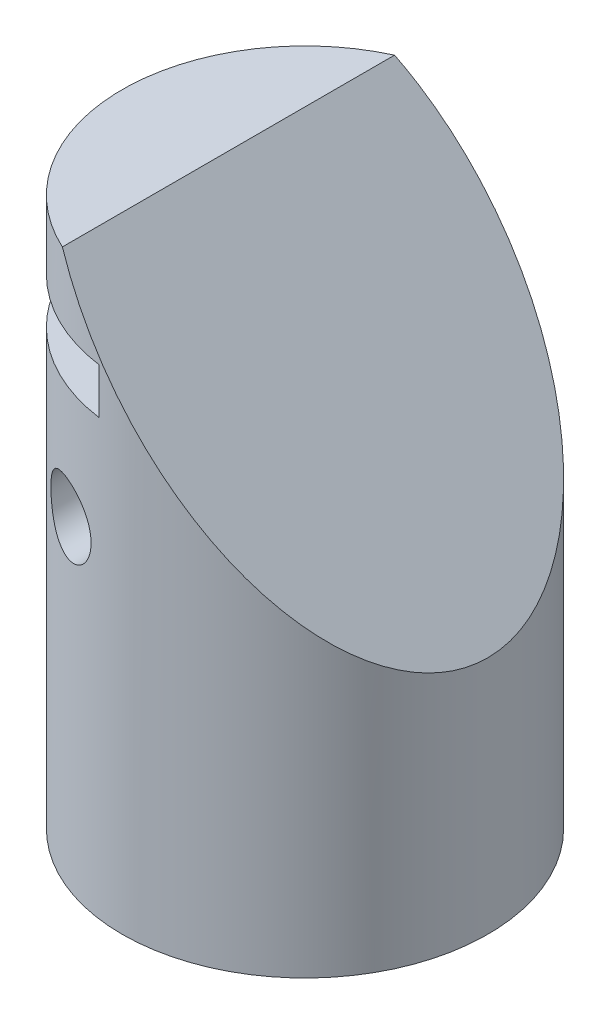
ISO-10303-21;
HEADER;
FILE_DESCRIPTION(('STEP AP214'),'2;1');
FILE_NAME('part.step','',(''),(''),'','','');
FILE_SCHEMA(('AUTOMOTIVE_DESIGN { 1 0 10303 214 1 1 1 1 }'));
ENDSEC;
DATA;
#1=APPLICATION_CONTEXT('core data for automotive mechanical design processes');
#2=APPLICATION_PROTOCOL_DEFINITION('international standard','automotive_design',2000,#1);
#3=PRODUCT_CONTEXT('',#1,'mechanical');
#4=PRODUCT('Part','Part','',(#3));
#5=PRODUCT_RELATED_PRODUCT_CATEGORY('part','',(#4));
#6=PRODUCT_DEFINITION_FORMATION('','',#4);
#7=PRODUCT_DEFINITION_CONTEXT('part definition',#1,'design');
#8=PRODUCT_DEFINITION('design','',#6,#7);
#9=PRODUCT_DEFINITION_SHAPE('','',#8);
#10=(LENGTH_UNIT() NAMED_UNIT(*) SI_UNIT(.MILLI.,.METRE.));
#11=(NAMED_UNIT(*) PLANE_ANGLE_UNIT() SI_UNIT($,.RADIAN.));
#12=(NAMED_UNIT(*) SI_UNIT($,.STERADIAN.) SOLID_ANGLE_UNIT());
#13=UNCERTAINTY_MEASURE_WITH_UNIT(LENGTH_MEASURE(1.E-05),#10,'distance_accuracy_value','');
#14=(GEOMETRIC_REPRESENTATION_CONTEXT(3) GLOBAL_UNCERTAINTY_ASSIGNED_CONTEXT((#13)) GLOBAL_UNIT_ASSIGNED_CONTEXT((#10,
#11,#12)) REPRESENTATION_CONTEXT('',''));
#15=CARTESIAN_POINT('',(0.,0.,0.));
#16=DIRECTION('',(0.,0.,1.));
#17=DIRECTION('',(1.,0.,0.));
#18=AXIS2_PLACEMENT_3D('',#15,#16,#17);
#19=CARTESIAN_POINT('',(131.582372263188,140.,99.1446322856636));
#20=DIRECTION('',(0.,-1.,0.));
#21=DIRECTION('',(0.,0.,-1.));
#22=AXIS2_PLACEMENT_3D('',#19,#20,#21);
#23=CYLINDRICAL_SURFACE('',#22,40.);
#24=CARTESIAN_POINT('',(109.082372263188,90.,132.216523673971));
#25=CARTESIAN_POINT('',(109.082372877846,89.8130297892475,132.216524234626));
#26=CARTESIAN_POINT('',(109.089373785037,89.6260505839779,132.22129035246));
#27=CARTESIAN_POINT('',(109.117267964173,89.2536095976207,132.240241783813));
#28=CARTESIAN_POINT('',(109.138162160264,89.0681479183056,132.254427723913));
#29=CARTESIAN_POINT('',(109.193527027699,88.7001555679004,132.291890426794));
#30=CARTESIAN_POINT('',(109.22800092398,88.5176256037648,132.315169348984));
#31=CARTESIAN_POINT('',(109.310039153169,88.156789189517,132.37030934642));
#32=CARTESIAN_POINT('',(109.357608882232,87.978484513405,132.402173959295));
#33=CARTESIAN_POINT('',(109.464927800473,87.6282165978609,132.473640332977));
#34=CARTESIAN_POINT('',(109.524613216204,87.4562255047083,132.513201537583));
#35=CARTESIAN_POINT('',(109.655610106744,87.1185402384194,132.599426421936));
#36=CARTESIAN_POINT('',(109.726926060077,86.9528485213852,132.646092837196));
#37=CARTESIAN_POINT('',(109.957188476416,86.4665303454707,132.795559334333));
#38=CARTESIAN_POINT('',(110.132529203657,86.1564050197422,132.907880579809));
#39=CARTESIAN_POINT('',(110.536526543553,85.5454865922268,133.16129805136));
#40=CARTESIAN_POINT('',(110.768348187909,85.2474766245336,133.303986775178));
#41=CARTESIAN_POINT('',(111.269294693779,84.6933181828923,133.604236622856));
#42=CARTESIAN_POINT('',(111.538437029241,84.4371894413185,133.7618047023));
#43=CARTESIAN_POINT('',(112.154050185274,83.93182754892,134.111534817324));
#44=CARTESIAN_POINT('',(112.506004455197,83.6902451108922,134.30519982998));
#45=CARTESIAN_POINT('',(113.059319710857,83.3755549066642,134.597988868422));
#46=CARTESIAN_POINT('',(113.248116194767,83.2785591962893,134.696029853118));
#47=CARTESIAN_POINT('',(113.633350552541,83.1008526981452,134.892068885248));
#48=CARTESIAN_POINT('',(113.829789424197,83.0201440453845,134.990066925374));
#49=CARTESIAN_POINT('',(114.246608284607,82.8692545970299,135.193622290549));
#50=CARTESIAN_POINT('',(114.467583575768,82.8006023561205,135.299094850855));
#51=CARTESIAN_POINT('',(114.915797202366,82.6838443228638,135.507887992109));
#52=CARTESIAN_POINT('',(115.143033327387,82.6357313755172,135.611209310505));
#53=CARTESIAN_POINT('',(115.602423250645,82.5606526516042,135.814843329001));
#54=CARTESIAN_POINT('',(115.834579032872,82.5336955800739,135.915154774315));
#55=CARTESIAN_POINT('',(116.301941891512,82.5015873747408,136.111816163077));
#56=CARTESIAN_POINT('',(116.537147475764,82.4964259530079,136.20816795428));
#57=CARTESIAN_POINT('',(117.003878566282,82.5082935478789,136.394186526857));
#58=CARTESIAN_POINT('',(117.235376567303,82.5248551037514,136.483951648292));
#59=CARTESIAN_POINT('',(117.697641827252,82.579735954426,136.658299768161));
#60=CARTESIAN_POINT('',(117.928409367835,82.6180454674644,136.742885077428));
#61=CARTESIAN_POINT('',(118.387221612669,82.7166241729504,136.906349649161));
#62=CARTESIAN_POINT('',(118.615266827618,82.7768891775876,136.98522999636));
#63=CARTESIAN_POINT('',(119.06648322873,82.9193819014421,137.136857236679));
#64=CARTESIAN_POINT('',(119.289654820986,83.0016077831679,137.209604642281));
#65=CARTESIAN_POINT('',(119.71163822374,83.1804673125279,137.343202550068));
#66=CARTESIAN_POINT('',(119.910989240179,83.2754689088544,137.404538569846));
#67=CARTESIAN_POINT('',(120.30178594059,83.4834864232812,137.521578123442));
#68=CARTESIAN_POINT('',(120.493232205702,83.5965010141242,137.577282071754));
#69=CARTESIAN_POINT('',(120.86635190633,83.8398767307966,137.682983397971));
#70=CARTESIAN_POINT('',(121.048028100424,83.9702329237304,137.732982391188));
#71=CARTESIAN_POINT('',(121.399887171232,84.2474608115936,137.827318057967));
#72=CARTESIAN_POINT('',(121.570070537028,84.3943318030183,137.871654972552));
#73=CARTESIAN_POINT('',(121.886857553265,84.6936949275108,137.952131485358));
#74=CARTESIAN_POINT('',(122.034272269234,84.845238199851,137.988612803669));
#75=CARTESIAN_POINT('',(122.316240830505,85.1608345728949,138.056839276003));
#76=CARTESIAN_POINT('',(122.450795264949,85.324887099919,138.088584647022));
#77=CARTESIAN_POINT('',(122.705843626358,85.6643155135749,138.147508799828));
#78=CARTESIAN_POINT('',(122.826339346801,85.8396899514208,138.174688164298));
#79=CARTESIAN_POINT('',(123.052232234577,86.2004983915397,138.224679626251));
#80=CARTESIAN_POINT('',(123.157629515523,86.3859323181018,138.247491756598));
#81=CARTESIAN_POINT('',(123.349756399017,86.7603129291898,138.288385592178));
#82=CARTESIAN_POINT('',(123.436915495158,86.9490271801955,138.306579009375));
#83=CARTESIAN_POINT('',(123.59538867984,87.3333868435318,138.339206466839));
#84=CARTESIAN_POINT('',(123.666697372718,87.5290345899086,138.353639227221));
#85=CARTESIAN_POINT('',(123.792837297619,87.9257509220972,138.378893912126));
#86=CARTESIAN_POINT('',(123.847672112917,88.1268183186834,138.389716621937));
#87=CARTESIAN_POINT('',(123.940443928879,88.5329712804563,138.407886974354));
#88=CARTESIAN_POINT('',(123.978380738314,88.7380568910881,138.415234577633));
#89=CARTESIAN_POINT('',(124.036871449874,89.1494981240223,138.42651488065));
#90=CARTESIAN_POINT('',(124.057530638882,89.3558382199349,138.430468268149));
#91=CARTESIAN_POINT('',(124.081694629729,89.7695610137402,138.435088981288));
#92=CARTESIAN_POINT('',(124.08519913448,89.9769437296269,138.435756250018));
#93=CARTESIAN_POINT('',(124.075026461609,90.3912240176203,138.433813817702));
#94=CARTESIAN_POINT('',(124.061353238136,90.5981216903972,138.43120487081));
#95=CARTESIAN_POINT('',(124.01692999643,91.0100957099943,138.422674417907));
#96=CARTESIAN_POINT('',(123.986172728801,91.2151712460556,138.41675150565));
#97=CARTESIAN_POINT('',(123.907839841992,91.6218453008718,138.401518824975));
#98=CARTESIAN_POINT('',(123.860273028573,91.8234455822742,138.392210829776));
#99=CARTESIAN_POINT('',(123.74871945657,92.2217615710842,138.370097383541));
#100=CARTESIAN_POINT('',(123.68473968985,92.4184793193949,138.357293421628));
#101=CARTESIAN_POINT('',(123.540847267963,92.8057632209112,138.328037736386));
#102=CARTESIAN_POINT('',(123.460931460133,92.9963281482096,138.311585291199));
#103=CARTESIAN_POINT('',(123.285820842692,93.3699160161711,138.274866530688));
#104=CARTESIAN_POINT('',(123.190626362073,93.5529391191239,138.254600297484));
#105=CARTESIAN_POINT('',(122.985666746744,93.9102775803262,138.210060137441));
#106=CARTESIAN_POINT('',(122.875892562293,94.0845874369435,138.185783719147));
#107=CARTESIAN_POINT('',(122.642719993758,94.4231704760086,138.1330523395));
#108=CARTESIAN_POINT('',(122.519321708483,94.5874437312339,138.10459740845));
#109=CARTESIAN_POINT('',(122.259898762613,94.9048662368707,138.043337235519));
#110=CARTESIAN_POINT('',(122.12387238651,95.058013970845,138.010531402315));
#111=CARTESIAN_POINT('',(121.840376933303,95.3521107268135,137.940441776488));
#112=CARTESIAN_POINT('',(121.692911686861,95.4930637994077,137.903159480678));
#113=CARTESIAN_POINT('',(121.386682649975,95.7628570913483,137.82373640057));
#114=CARTESIAN_POINT('',(121.227849631514,95.8916096055928,137.781564669034));
#115=CARTESIAN_POINT('',(120.901079316712,96.1351687515183,137.692507105283));
#116=CARTESIAN_POINT('',(120.733142014626,96.2499753744011,137.645621270093));
#117=CARTESIAN_POINT('',(120.389541953956,96.4650236362887,137.547138452643));
#118=CARTESIAN_POINT('',(120.213880251918,96.5652672592012,137.495542113654));
#119=CARTESIAN_POINT('',(119.856127121338,96.7507886517088,137.38767206097));
#120=CARTESIAN_POINT('',(119.674033408183,96.8360610380709,137.331396675497));
#121=CARTESIAN_POINT('',(119.300098691108,96.9932933417279,137.212797538985));
#122=CARTESIAN_POINT('',(119.108127437095,97.0648540714805,137.150355383229));
#123=CARTESIAN_POINT('',(118.720326111249,97.1917169807298,137.020872522502));
#124=CARTESIAN_POINT('',(118.524494660536,97.2470132339276,136.953830152293));
#125=CARTESIAN_POINT('',(118.130454200834,97.3412859718396,136.815436630285));
#126=CARTESIAN_POINT('',(117.932245259369,97.3802629189256,136.744085600627));
#127=CARTESIAN_POINT('',(117.534775029335,97.4420016285676,136.597401269954));
#128=CARTESIAN_POINT('',(117.335513660284,97.4647621323666,136.522067660289));
#129=CARTESIAN_POINT('',(116.925735305164,97.4951111455106,136.363363639839));
#130=CARTESIAN_POINT('',(116.715229895494,97.5017520644118,136.279780182936));
#131=CARTESIAN_POINT('',(116.29586537,97.4974609785231,136.109129706436));
#132=CARTESIAN_POINT('',(116.087006314685,97.4865283308408,136.022062559509));
#133=CARTESIAN_POINT('',(115.464741578367,97.4279434830699,135.756443228401));
#134=CARTESIAN_POINT('',(115.055442298423,97.3545187586327,135.573393279733));
#135=CARTESIAN_POINT('',(114.226504795466,97.1342667506904,135.186259630235));
#136=CARTESIAN_POINT('',(113.808499130755,96.9822205417321,134.981641894748));
#137=CARTESIAN_POINT('',(113.206690530902,96.7010419656927,134.674697570077));
#138=CARTESIAN_POINT('',(113.010150819165,96.5983680214535,134.572303651249));
#139=CARTESIAN_POINT('',(112.626462082001,96.3757305685869,134.368495487185));
#140=CARTESIAN_POINT('',(112.43931437488,96.2557646418794,134.267081381086));
#141=CARTESIAN_POINT('',(112.067283057596,95.9931779695892,134.061798820974));
#142=CARTESIAN_POINT('',(111.882899393193,95.8497690738583,133.958031986066));
#143=CARTESIAN_POINT('',(111.527137366256,95.5452156292453,133.754306633946));
#144=CARTESIAN_POINT('',(111.355757830027,95.3840726841854,133.65434777345));
#145=CARTESIAN_POINT('',(111.027586853442,95.044801535603,133.459893564345));
#146=CARTESIAN_POINT('',(110.87078467402,94.8666860347444,133.365394213486));
#147=CARTESIAN_POINT('',(110.573260364793,94.4941474506138,133.183545381038));
#148=CARTESIAN_POINT('',(110.432533460477,94.2997292393089,133.096193778696));
#149=CARTESIAN_POINT('',(110.198594262894,93.941107788472,132.949197153625));
#150=CARTESIAN_POINT('',(110.101818427826,93.7799592623666,132.887742486397));
#151=CARTESIAN_POINT('',(109.919826970909,93.449075619778,132.771196254145));
#152=CARTESIAN_POINT('',(109.834608987297,93.2793422673037,132.716103389477));
#153=CARTESIAN_POINT('',(109.676693498088,92.9322211817769,132.613276025442));
#154=CARTESIAN_POINT('',(109.603982904437,92.754841696003,132.565533839697));
#155=CARTESIAN_POINT('',(109.47185351979,92.3932325548267,132.478267523994));
#156=CARTESIAN_POINT('',(109.412433440552,92.2090035653638,132.438742597567));
#157=CARTESIAN_POINT('',(109.314545353084,91.8593576232244,132.373337947473));
#158=CARTESIAN_POINT('',(109.274354024985,91.6946286325629,132.346350024536));
#159=CARTESIAN_POINT('',(109.205090491576,91.3618339671647,132.29970743978));
#160=CARTESIAN_POINT('',(109.176017047837,91.1937686662573,132.280051961202));
#161=CARTESIAN_POINT('',(109.129344168691,90.8553110420589,132.248443652317));
#162=CARTESIAN_POINT('',(109.111746005904,90.6849184628088,132.236491676338));
#163=CARTESIAN_POINT('',(109.088261852348,90.3430195002725,132.220532841767));
#164=CARTESIAN_POINT('',(109.082371699344,90.1715135345604,132.216523159665));
#165=CARTESIAN_POINT('',(109.082372263188,90.,132.216523673971));
#166=B_SPLINE_CURVE_WITH_KNOTS('',3,(#24,#25,#26,#27,#28,#29,#30,#31,#32,#33,#34,#35,#36,#37,
#38,#39,#40,#41,#42,#43,#44,#45,#46,#47,#48,#49,#50,#51,#52,#53,#54,#55,#56,#57,#58,#59,#60,#61,
#62,#63,#64,#65,#66,#67,#68,#69,#70,#71,#72,#73,#74,#75,#76,#77,#78,#79,#80,#81,#82,#83,#84,#85,
#86,#87,#88,#89,#90,#91,#92,#93,#94,#95,#96,#97,#98,#99,#100,#101,#102,#103,#104,#105,#106,#107,
#108,#109,#110,#111,#112,#113,#114,#115,#116,#117,#118,#119,#120,#121,#122,#123,#124,#125,#126,
#127,#128,#129,#130,#131,#132,#133,#134,#135,#136,#137,#138,#139,#140,#141,#142,#143,#144,#145,
#146,#147,#148,#149,#150,#151,#152,#153,#154,#155,#156,#157,#158,#159,#160,#161,#162,#163,#164,
#165),.UNSPECIFIED.,.T.,.F.,(4,2,2,2,2,2,2,2,2,2,2,2,2,2,2,2,2,2,2,2,2,2,2,2,2,2,2,2,2,2,2,2,2,
2,2,2,2,2,2,2,2,2,2,2,2,2,2,2,2,2,2,2,2,2,2,2,2,2,2,2,2,2,2,2,2,2,2,2,2,2,4),(0.,
0.560736167618824,1.12150963768917,1.68241636184398,2.24355455517622,2.80181229651595,
3.3602855136259,4.47642108325264,5.6828228678729,6.88979142205971,8.28974616947415,
8.99061043278874,9.69156651014362,10.4535556013712,11.215279031596,11.9773157250728,
12.7389926835882,13.4845448597526,14.229761967953,14.9748370071213,15.7198497245364,
16.4065332599183,17.0931662215489,17.7796042833598,18.4660131150504,19.1088435355764,
19.7516444933423,20.3943633587709,21.0370773875749,21.6623240094423,22.2877831477722,
22.9131061422359,23.5384362130388,24.1599272734283,24.7814290969079,25.4027878827956,
26.0244105359611,26.645708030667,27.2667412929271,27.8878975376497,28.5090404089542,
29.1305706464383,29.7520963765364,30.3737066638505,30.9951096768599,31.62068592334,
32.246262564477,32.8717539036491,33.4974696932272,34.1392923818586,34.7813486429939,
35.4233867116376,36.0654746113059,36.7444807188929,37.4235116670745,38.78091666271,
40.2428913275362,40.974968843127,41.7071488306304,42.4730013077498,43.2387845799453,
44.0039991571228,44.76898586399,45.3617082665138,45.9543093674387,46.5462865323431,
47.1382062923126,47.6527701006677,48.1672765746843,48.6818400983207,49.1962206602137),.UNSPECIFIED.);
#167=CARTESIAN_POINT('',(109.082372263188,90.,132.216523673971));
#168=VERTEX_POINT('',#167);
#169=EDGE_CURVE('E100',#168,#168,#166,.T.);
#170=ORIENTED_EDGE('',*,*,#169,.F.);
#171=EDGE_LOOP('',(#170));
#172=FACE_BOUND('',#171,.T.);
#173=CARTESIAN_POINT('',(109.082372263188,90.,66.0727408973563));
#174=CARTESIAN_POINT('',(109.082372877846,90.1869702107526,66.0727403367014));
#175=CARTESIAN_POINT('',(109.089373785037,90.3739494160221,66.0679742188674));
#176=CARTESIAN_POINT('',(109.117267964173,90.7463904023794,66.0490227875148));
#177=CARTESIAN_POINT('',(109.138162160264,90.9318520816944,66.034836847414));
#178=CARTESIAN_POINT('',(109.193527027699,91.2998444320996,65.9973741445332));
#179=CARTESIAN_POINT('',(109.22800092398,91.4823743962352,65.9740952223428));
#180=CARTESIAN_POINT('',(109.310039153169,91.843210810483,65.9189552249074));
#181=CARTESIAN_POINT('',(109.357608882232,92.0215154865951,65.8870906120326));
#182=CARTESIAN_POINT('',(109.464927800473,92.3717834021391,65.81562423835));
#183=CARTESIAN_POINT('',(109.524613216204,92.5437744952917,65.7760630337447));
#184=CARTESIAN_POINT('',(109.655610106744,92.8814597615806,65.6898381493915));
#185=CARTESIAN_POINT('',(109.726926060077,93.0471514786148,65.6431717341312));
#186=CARTESIAN_POINT('',(109.957188476416,93.5334696545293,65.4937052369939));
#187=CARTESIAN_POINT('',(110.132529203657,93.8435949802578,65.381383991518));
#188=CARTESIAN_POINT('',(110.536526543553,94.4545134077732,65.1279665199671));
#189=CARTESIAN_POINT('',(110.768348187909,94.7525233754664,64.9852777961492));
#190=CARTESIAN_POINT('',(111.269294693779,95.3066818171077,64.6850279484716));
#191=CARTESIAN_POINT('',(111.538437029241,95.5628105586815,64.5274598690268));
#192=CARTESIAN_POINT('',(112.154050185274,96.06817245108,64.1777297540035));
#193=CARTESIAN_POINT('',(112.506004455197,96.3097548891078,63.9840647413477));
#194=CARTESIAN_POINT('',(113.059319710857,96.6244450933358,63.6912757029057));
#195=CARTESIAN_POINT('',(113.248116194767,96.7214408037108,63.5932347182096));
#196=CARTESIAN_POINT('',(113.633350552541,96.8991473018549,63.3971956860797));
#197=CARTESIAN_POINT('',(113.829789424197,96.9798559546155,63.2991976459531));
#198=CARTESIAN_POINT('',(114.246608284607,97.1307454029701,63.0956422807781));
#199=CARTESIAN_POINT('',(114.467583575768,97.1993976438795,62.9901697204719));
#200=CARTESIAN_POINT('',(114.915797202366,97.3161556771362,62.7813765792186));
#201=CARTESIAN_POINT('',(115.143033327387,97.3642686244828,62.6780552608225));
#202=CARTESIAN_POINT('',(115.602423250645,97.4393473483959,62.474421242326));
#203=CARTESIAN_POINT('',(115.834579032872,97.4663044199261,62.3741097970126));
#204=CARTESIAN_POINT('',(116.301941891512,97.4984126252592,62.17744840825));
#205=CARTESIAN_POINT('',(116.537147475764,97.5035740469922,62.0810966170477));
#206=CARTESIAN_POINT('',(117.003878566282,97.4917064521211,61.8950780444701));
#207=CARTESIAN_POINT('',(117.235376567303,97.4751448962486,61.8053129230356));
#208=CARTESIAN_POINT('',(117.697641827252,97.420264045574,61.6309648031663));
#209=CARTESIAN_POINT('',(117.928409367835,97.3819545325356,61.5463794938993));
#210=CARTESIAN_POINT('',(118.387221612669,97.2833758270496,61.3829149221666));
#211=CARTESIAN_POINT('',(118.615266827618,97.2231108224124,61.3040345749677));
#212=CARTESIAN_POINT('',(119.06648322873,97.080618098558,61.1524073346479));
#213=CARTESIAN_POINT('',(119.289654820986,96.9983922168321,61.0796599290465));
#214=CARTESIAN_POINT('',(119.71163822374,96.8195326874722,60.9460620212595));
#215=CARTESIAN_POINT('',(119.910989240179,96.7245310911456,60.884726001481));
#216=CARTESIAN_POINT('',(120.30178594059,96.5165135767188,60.7676864478857));
#217=CARTESIAN_POINT('',(120.493232205702,96.4034989858758,60.7119824995729));
#218=CARTESIAN_POINT('',(120.86635190633,96.1601232692034,60.6062811733567));
#219=CARTESIAN_POINT('',(121.048028100424,96.0297670762696,60.5562821801392));
#220=CARTESIAN_POINT('',(121.399887171232,95.7525391884065,60.4619465133604));
#221=CARTESIAN_POINT('',(121.570070537028,95.6056681969817,60.417609598775));
#222=CARTESIAN_POINT('',(121.886857553265,95.3063050724892,60.3371330859695));
#223=CARTESIAN_POINT('',(122.034272269234,95.154761800149,60.3006517676586));
#224=CARTESIAN_POINT('',(122.316240830505,94.8391654271052,60.2324252953241));
#225=CARTESIAN_POINT('',(122.450795264949,94.6751129000811,60.2006799243052));
#226=CARTESIAN_POINT('',(122.705843626358,94.3356844864251,60.1417557714995));
#227=CARTESIAN_POINT('',(122.826339346801,94.1603100485792,60.1145764070297));
#228=CARTESIAN_POINT('',(123.052232234577,93.7995016084604,60.0645849450763));
#229=CARTESIAN_POINT('',(123.157629515523,93.6140676818982,60.0417728147295));
#230=CARTESIAN_POINT('',(123.349756399017,93.2396870708102,60.0008789791497));
#231=CARTESIAN_POINT('',(123.436915495158,93.0509728198046,59.9826855619521));
#232=CARTESIAN_POINT('',(123.59538867984,92.6666131564683,59.9500581044882));
#233=CARTESIAN_POINT('',(123.666697372718,92.4709654100914,59.9356253441066));
#234=CARTESIAN_POINT('',(123.792837297619,92.0742490779028,59.9103706592015));
#235=CARTESIAN_POINT('',(123.847672112917,91.8731816813167,59.8995479493901));
#236=CARTESIAN_POINT('',(123.940443928879,91.4670287195437,59.8813775969732));
#237=CARTESIAN_POINT('',(123.978380738314,91.2619431089119,59.874029993694));
#238=CARTESIAN_POINT('',(124.036871449874,90.8505018759777,59.8627496906772));
#239=CARTESIAN_POINT('',(124.057530638882,90.6441617800651,59.8587963031781));
#240=CARTESIAN_POINT('',(124.081694629729,90.2304389862599,59.8541755900395));
#241=CARTESIAN_POINT('',(124.08519913448,90.0230562703731,59.8535083213097));
#242=CARTESIAN_POINT('',(124.075026461609,89.6087759823797,59.8554507536253));
#243=CARTESIAN_POINT('',(124.061353238136,89.4018783096028,59.8580597005171));
#244=CARTESIAN_POINT('',(124.01692999643,88.9899042900058,59.8665901534198));
#245=CARTESIAN_POINT('',(123.986172728801,88.7848287539445,59.8725130656773));
#246=CARTESIAN_POINT('',(123.907839841992,88.3781546991282,59.887745746352));
#247=CARTESIAN_POINT('',(123.860273028573,88.1765544177258,59.8970537415514));
#248=CARTESIAN_POINT('',(123.74871945657,87.7782384289158,59.9191671877858));
#249=CARTESIAN_POINT('',(123.68473968985,87.5815206806051,59.9319711496995));
#250=CARTESIAN_POINT('',(123.540847267963,87.1942367790888,59.961226834941));
#251=CARTESIAN_POINT('',(123.460931460133,87.0036718517904,59.9776792801285));
#252=CARTESIAN_POINT('',(123.285820842692,86.6300839838289,60.0143980406397));
#253=CARTESIAN_POINT('',(123.190626362073,86.4470608808761,60.0346642738437));
#254=CARTESIAN_POINT('',(122.985666746744,86.0897224196738,60.0792044338866));
#255=CARTESIAN_POINT('',(122.875892562293,85.9154125630565,60.10348085218));
#256=CARTESIAN_POINT('',(122.642719993758,85.5768295239914,60.1562122318275));
#257=CARTESIAN_POINT('',(122.519321708483,85.4125562687661,60.1846671628771));
#258=CARTESIAN_POINT('',(122.259898762613,85.0951337631293,60.2459273358079));
#259=CARTESIAN_POINT('',(122.12387238651,84.941986029155,60.2787331690127));
#260=CARTESIAN_POINT('',(121.840376933303,84.6478892731866,60.348822794839));
#261=CARTESIAN_POINT('',(121.692911686861,84.5069362005923,60.3861050906493));
#262=CARTESIAN_POINT('',(121.386682649975,84.2371429086517,60.4655281707573));
#263=CARTESIAN_POINT('',(121.227849631514,84.1083903944072,60.507699902293));
#264=CARTESIAN_POINT('',(120.901079316712,83.8648312484817,60.5967574660445));
#265=CARTESIAN_POINT('',(120.733142014626,83.7500246255989,60.6436433012342));
#266=CARTESIAN_POINT('',(120.389541953956,83.5349763637113,60.7421261186842));
#267=CARTESIAN_POINT('',(120.213880251918,83.4347327407988,60.7937224576732));
#268=CARTESIAN_POINT('',(119.856127121338,83.2492113482912,60.901592510357));
#269=CARTESIAN_POINT('',(119.674033408183,83.1639389619291,60.9578678958303));
#270=CARTESIAN_POINT('',(119.300098691108,83.0067066582721,61.0764670323427));
#271=CARTESIAN_POINT('',(119.108127437095,82.9351459285195,61.1389091880983));
#272=CARTESIAN_POINT('',(118.720326111249,82.8082830192702,61.2683920488255));
#273=CARTESIAN_POINT('',(118.524494660536,82.7529867660724,61.3354344190342));
#274=CARTESIAN_POINT('',(118.130454200834,82.6587140281604,61.4738279410427));
#275=CARTESIAN_POINT('',(117.932245259369,82.6197370810745,61.5451789707004));
#276=CARTESIAN_POINT('',(117.534775029335,82.5579983714324,61.6918633013737));
#277=CARTESIAN_POINT('',(117.335513660284,82.5352378676334,61.7671969110386));
#278=CARTESIAN_POINT('',(116.925735305164,82.5048888544895,61.9259009314881));
#279=CARTESIAN_POINT('',(116.715229895494,82.4982479355883,62.0094843883911));
#280=CARTESIAN_POINT('',(116.29586537,82.5025390214769,62.1801348648911));
#281=CARTESIAN_POINT('',(116.087006314685,82.5134716691592,62.267202011818));
#282=CARTESIAN_POINT('',(115.464741578367,82.5720565169302,62.532821342926));
#283=CARTESIAN_POINT('',(115.055442298423,82.6454812413674,62.715871291594));
#284=CARTESIAN_POINT('',(114.226504795466,82.8657332493096,63.1030049410928));
#285=CARTESIAN_POINT('',(113.808499130755,83.0177794582679,63.3076226765796));
#286=CARTESIAN_POINT('',(113.206690530902,83.2989580343073,63.6145670012499));
#287=CARTESIAN_POINT('',(113.010150819164,83.4016319785465,63.7169609200787));
#288=CARTESIAN_POINT('',(112.626462082001,83.6242694314131,63.920769084142));
#289=CARTESIAN_POINT('',(112.43931437488,83.7442353581206,64.0221831902413));
#290=CARTESIAN_POINT('',(112.067283057596,84.0068220304109,64.2274657503529));
#291=CARTESIAN_POINT('',(111.882899393193,84.1502309261417,64.3312325852618));
#292=CARTESIAN_POINT('',(111.527137366257,84.4547843707548,64.5349579373816));
#293=CARTESIAN_POINT('',(111.355757830027,84.6159273158146,64.6349167978773));
#294=CARTESIAN_POINT('',(111.027586853442,84.955198464397,64.829371006982));
#295=CARTESIAN_POINT('',(110.87078467402,85.1333139652556,64.9238703578414));
#296=CARTESIAN_POINT('',(110.573260364793,85.5058525493862,65.1057191902897));
#297=CARTESIAN_POINT('',(110.432533460477,85.7002707606912,65.193070792631));
#298=CARTESIAN_POINT('',(110.198594262894,86.058892211528,65.3400674177021));
#299=CARTESIAN_POINT('',(110.101818427826,86.2200407376334,65.4015220849306));
#300=CARTESIAN_POINT('',(109.919826970909,86.550924380222,65.5180683171821));
#301=CARTESIAN_POINT('',(109.834608987297,86.7206577326964,65.5731611818505));
#302=CARTESIAN_POINT('',(109.676693498088,87.0677788182231,65.6759885458848));
#303=CARTESIAN_POINT('',(109.603982904437,87.2451583039971,65.7237307316305));
#304=CARTESIAN_POINT('',(109.47185351979,87.6067674451733,65.8109970473338));
#305=CARTESIAN_POINT('',(109.412433440552,87.7909964346362,65.8505219737598));
#306=CARTESIAN_POINT('',(109.314545353084,88.1406423767756,65.9159266238541));
#307=CARTESIAN_POINT('',(109.274354024985,88.3053713674372,65.9429145467918));
#308=CARTESIAN_POINT('',(109.205090491576,88.6381660328353,65.9895571315472));
#309=CARTESIAN_POINT('',(109.176017047837,88.8062313337427,66.0092126101253));
#310=CARTESIAN_POINT('',(109.129344168691,89.1446889579412,66.0408209190107));
#311=CARTESIAN_POINT('',(109.111746005904,89.3150815371912,66.0527728949897));
#312=CARTESIAN_POINT('',(109.088261852348,89.6569804997276,66.0687317295608));
#313=CARTESIAN_POINT('',(109.082371699344,89.8284864654396,66.0727414116622));
#314=CARTESIAN_POINT('',(109.082372263188,90.,66.0727408973563));
#315=B_SPLINE_CURVE_WITH_KNOTS('',3,(#173,#174,#175,#176,#177,#178,#179,#180,#181,#182,#183,
#184,#185,#186,#187,#188,#189,#190,#191,#192,#193,#194,#195,#196,#197,#198,#199,#200,#201,#202,
#203,#204,#205,#206,#207,#208,#209,#210,#211,#212,#213,#214,#215,#216,#217,#218,#219,#220,#221,
#222,#223,#224,#225,#226,#227,#228,#229,#230,#231,#232,#233,#234,#235,#236,#237,#238,#239,#240,
#241,#242,#243,#244,#245,#246,#247,#248,#249,#250,#251,#252,#253,#254,#255,#256,#257,#258,#259,
#260,#261,#262,#263,#264,#265,#266,#267,#268,#269,#270,#271,#272,#273,#274,#275,#276,#277,#278,
#279,#280,#281,#282,#283,#284,#285,#286,#287,#288,#289,#290,#291,#292,#293,#294,#295,#296,#297,
#298,#299,#300,#301,#302,#303,#304,#305,#306,#307,#308,#309,#310,#311,#312,#313,#314),
.UNSPECIFIED.,.T.,.F.,(4,2,2,2,2,2,2,2,2,2,2,2,2,2,2,2,2,2,2,2,2,2,2,2,2,2,2,2,2,2,2,2,2,2,2,2,
2,2,2,2,2,2,2,2,2,2,2,2,2,2,2,2,2,2,2,2,2,2,2,2,2,2,2,2,2,2,2,2,2,2,4),(0.,0.560736167618823,
1.12150963768917,1.68241636184398,2.24355455517622,2.80181229651594,3.36028551362587,
4.47642108325262,5.68282286787289,6.88979142205971,8.28974616947416,8.99061043278873,
9.69156651014363,10.4535556013713,11.215279031596,11.9773157250728,12.7389926835882,
13.4845448597526,14.229761967953,14.9748370071213,15.7198497245364,16.4065332599183,
17.093166221549,17.7796042833598,18.4660131150504,19.1088435355764,19.7516444933422,
20.3943633587709,21.0370773875749,21.6623240094423,22.2877831477722,22.9131061422359,
23.5384362130388,24.1599272734283,24.7814290969079,25.4027878827957,26.0244105359611,
26.645708030667,27.2667412929271,27.8878975376497,28.5090404089542,29.1305706464383,
29.7520963765365,30.3737066638506,30.9951096768599,31.6206859233401,32.246262564477,
32.8717539036491,33.4974696932273,34.1392923818586,34.7813486429939,35.4233867116377,
36.0654746113059,36.7444807188929,37.4235116670745,38.7809166627101,40.2428913275362,
40.9749688431271,41.7071488306304,42.4730013077498,43.2387845799454,44.0039991571228,
44.76898586399,45.3617082665139,45.9543093674388,46.5462865323431,47.1382062923127,
47.6527701006677,48.1672765746843,48.6818400983207,49.1962206602138),.UNSPECIFIED.);
#316=CARTESIAN_POINT('',(109.082372263188,90.,66.0727408973563));
#317=VERTEX_POINT('',#316);
#318=EDGE_CURVE('E78',#317,#317,#315,.T.);
#319=ORIENTED_EDGE('',*,*,#318,.F.);
#320=EDGE_LOOP('',(#319));
#321=FACE_BOUND('',#320,.T.);
#322=CARTESIAN_POINT('',(131.582372263188,20.,99.1446322856636));
#323=DIRECTION('',(0.,1.,0.));
#324=DIRECTION('',(0.,0.,1.));
#325=AXIS2_PLACEMENT_3D('',#322,#323,#324);
#326=CIRCLE('',#325,40.);
#327=CARTESIAN_POINT('',(131.582372263188,20.,139.144632285664));
#328=VERTEX_POINT('',#327);
#329=EDGE_CURVE('E81',#328,#328,#326,.T.);
#330=ORIENTED_EDGE('',*,*,#329,.T.);
#331=EDGE_LOOP('',(#330));
#332=FACE_BOUND('',#331,.T.);
#333=CARTESIAN_POINT('',(131.582372263188,115.,99.1446322856636));
#334=DIRECTION('',(0.,1.,0.));
#335=DIRECTION('',(0.,0.,1.));
#336=AXIS2_PLACEMENT_3D('',#333,#334,#335);
#337=CIRCLE('',#336,40.);
#338=CARTESIAN_POINT('',(126.126485259106,115.,59.5184629401581));
#339=VERTEX_POINT('',#338);
#340=CARTESIAN_POINT('',(126.126485259106,115.,138.770801631169));
#341=VERTEX_POINT('',#340);
#342=EDGE_CURVE('E11',#339,#341,#337,.T.);
#343=ORIENTED_EDGE('',*,*,#342,.F.);
#344=DIRECTION('',(0.,-1.,0.));
#345=VECTOR('',#344,1.);
#346=CARTESIAN_POINT('',(126.126485259106,140.,59.518462940158));
#347=LINE('',#346,#345);
#348=CARTESIAN_POINT('',(126.126485259106,125.,59.518462940158));
#349=VERTEX_POINT('',#348);
#350=EDGE_CURVE('E50',#349,#339,#347,.T.);
#351=ORIENTED_EDGE('',*,*,#350,.F.);
#352=CARTESIAN_POINT('',(131.582372263188,125.,99.1446322856636));
#353=DIRECTION('',(0.,-1.,0.));
#354=DIRECTION('',(0.,0.,-1.));
#355=AXIS2_PLACEMENT_3D('',#352,#353,#354);
#356=CIRCLE('',#355,40.);
#357=CARTESIAN_POINT('',(126.126485259106,125.,138.770801631169));
#358=VERTEX_POINT('',#357);
#359=EDGE_CURVE('E73',#358,#349,#356,.T.);
#360=ORIENTED_EDGE('',*,*,#359,.F.);
#361=DIRECTION('',(0.,-1.,0.));
#362=VECTOR('',#361,1.);
#363=CARTESIAN_POINT('',(126.126485259106,140.,138.770801631169));
#364=LINE('',#363,#362);
#365=EDGE_CURVE('E142',#341,#358,#364,.F.);
#366=ORIENTED_EDGE('',*,*,#365,.F.);
#367=EDGE_LOOP('',(#343,#351,#360,#366));
#368=FACE_BOUND('',#367,.T.);
#369=CARTESIAN_POINT('',(131.582372263188,120.053650888957,99.1446322856636));
#370=DIRECTION('',(0.766044443118982,0.642787609686535,0.));
#371=DIRECTION('',(0.642787609686535,-0.766044443118982,0.));
#372=AXIS2_PLACEMENT_3D('',#369,#370,#371);
#373=ELLIPSE('',#372,62.2289530744169,40.);
#374=CARTESIAN_POINT('',(114.845398080779,140.,135.474698280888));
#375=VERTEX_POINT('',#374);
#376=CARTESIAN_POINT('',(114.845398080779,140.,62.814566290439));
#377=VERTEX_POINT('',#376);
#378=EDGE_CURVE('E58',#375,#377,#373,.T.);
#379=ORIENTED_EDGE('',*,*,#378,.F.);
#380=CARTESIAN_POINT('',(131.582372263188,140.,99.1446322856636));
#381=DIRECTION('',(0.,1.,0.));
#382=DIRECTION('',(0.,0.,1.));
#383=AXIS2_PLACEMENT_3D('',#380,#381,#382);
#384=CIRCLE('',#383,40.);
#385=EDGE_CURVE('E76',#377,#375,#384,.T.);
#386=ORIENTED_EDGE('',*,*,#385,.F.);
#387=EDGE_LOOP('',(#379,#386));
#388=FACE_BOUND('',#387,.T.);
#389=ADVANCED_FACE('F39',(#172,#321,#332,#368,#388),#23,.T.);
#390=CARTESIAN_POINT('',(131.582372263188,140.,99.1446322856636));
#391=DIRECTION('',(0.,1.,0.));
#392=DIRECTION('',(0.,0.,1.));
#393=AXIS2_PLACEMENT_3D('',#390,#391,#392);
#394=PLANE('',#393);
#395=ORIENTED_EDGE('',*,*,#385,.T.);
#396=DIRECTION('',(0.,0.,-1.));
#397=VECTOR('',#396,1.);
#398=CARTESIAN_POINT('',(114.845398080779,140.,99.1446322856636));
#399=LINE('',#398,#397);
#400=EDGE_CURVE('E67',#375,#377,#399,.T.);
#401=ORIENTED_EDGE('',*,*,#400,.T.);
#402=EDGE_LOOP('',(#395,#401));
#403=FACE_BOUND('',#402,.T.);
#404=ADVANCED_FACE('F84',(#403),#394,.T.);
#405=CARTESIAN_POINT('',(131.582372263188,20.,99.1446322856636));
#406=DIRECTION('',(0.,1.,0.));
#407=DIRECTION('',(0.,0.,1.));
#408=AXIS2_PLACEMENT_3D('',#405,#406,#407);
#409=PLANE('',#408);
#410=CARTESIAN_POINT('',(131.582372263188,20.,99.1446322856636));
#411=DIRECTION('',(0.,1.,0.));
#412=DIRECTION('',(0.,0.,1.));
#413=AXIS2_PLACEMENT_3D('',#410,#411,#412);
#414=CIRCLE('',#413,25.);
#415=CARTESIAN_POINT('',(131.582372263188,20.,124.144632285664));
#416=VERTEX_POINT('',#415);
#417=EDGE_CURVE('E86',#416,#416,#414,.T.);
#418=ORIENTED_EDGE('',*,*,#417,.T.);
#419=EDGE_LOOP('',(#418));
#420=FACE_BOUND('',#419,.T.);
#421=ORIENTED_EDGE('',*,*,#329,.F.);
#422=EDGE_LOOP('',(#421));
#423=FACE_BOUND('',#422,.T.);
#424=ADVANCED_FACE('F117',(#420,#423),#409,.F.);
#425=CARTESIAN_POINT('',(131.582372263188,60.,99.1446322856636));
#426=DIRECTION('',(0.,-1.,0.));
#427=DIRECTION('',(0.,0.,-1.));
#428=AXIS2_PLACEMENT_3D('',#425,#426,#427);
#429=CYLINDRICAL_SURFACE('',#428,25.);
#430=CARTESIAN_POINT('',(131.582372263188,60.,99.1446322856636));
#431=DIRECTION('',(0.,1.,0.));
#432=DIRECTION('',(0.,0.,1.));
#433=AXIS2_PLACEMENT_3D('',#430,#431,#432);
#434=CIRCLE('',#433,25.);
#435=CARTESIAN_POINT('',(131.582372263188,60.,124.144632285664));
#436=VERTEX_POINT('',#435);
#437=EDGE_CURVE('E82',#436,#436,#434,.T.);
#438=ORIENTED_EDGE('',*,*,#437,.T.);
#439=EDGE_LOOP('',(#438));
#440=FACE_BOUND('',#439,.T.);
#441=ORIENTED_EDGE('',*,*,#417,.F.);
#442=EDGE_LOOP('',(#441));
#443=FACE_BOUND('',#442,.T.);
#444=ADVANCED_FACE('F111',(#440,#443),#429,.F.);
#445=CARTESIAN_POINT('',(131.582372263188,60.,99.1446322856636));
#446=DIRECTION('',(0.,1.,0.));
#447=DIRECTION('',(0.,0.,1.));
#448=AXIS2_PLACEMENT_3D('',#445,#446,#447);
#449=PLANE('',#448);
#450=ORIENTED_EDGE('',*,*,#437,.F.);
#451=EDGE_LOOP('',(#450));
#452=FACE_BOUND('',#451,.T.);
#453=ADVANCED_FACE('F109',(#452),#449,.F.);
#454=CARTESIAN_POINT('',(113.167198818425,142.,139.144632285664));
#455=DIRECTION('',(0.766044443118982,0.642787609686535,0.));
#456=DIRECTION('',(-0.642787609686535,0.766044443118982,0.));
#457=AXIS2_PLACEMENT_3D('',#454,#455,#456);
#458=PLANE('',#457);
#459=ORIENTED_EDGE('',*,*,#378,.T.);
#460=ORIENTED_EDGE('',*,*,#400,.F.);
#461=EDGE_LOOP('',(#459,#460));
#462=FACE_BOUND('',#461,.T.);
#463=ADVANCED_FACE('F72',(#462),#458,.T.);
#464=CARTESIAN_POINT('',(116.582372263188,90.,139.144632285664));
#465=DIRECTION('',(0.,0.,-1.));
#466=DIRECTION('',(-1.,0.,0.));
#467=AXIS2_PLACEMENT_3D('',#464,#465,#466);
#468=CYLINDRICAL_SURFACE('',#467,7.5);
#469=ORIENTED_EDGE('',*,*,#318,.T.);
#470=EDGE_LOOP('',(#469));
#471=FACE_BOUND('',#470,.T.);
#472=ORIENTED_EDGE('',*,*,#169,.T.);
#473=EDGE_LOOP('',(#472));
#474=FACE_BOUND('',#473,.T.);
#475=ADVANCED_FACE('F105',(#471,#474),#468,.F.);
#476=CARTESIAN_POINT('',(126.126485259106,115.,139.144632285664));
#477=DIRECTION('',(0.,1.,0.));
#478=DIRECTION('',(0.,0.,1.));
#479=AXIS2_PLACEMENT_3D('',#476,#477,#478);
#480=PLANE('',#479);
#481=ORIENTED_EDGE('',*,*,#342,.T.);
#482=DIRECTION('',(0.,0.,-1.));
#483=VECTOR('',#482,1.);
#484=CARTESIAN_POINT('',(126.126485259106,115.,139.144632285664));
#485=LINE('',#484,#483);
#486=EDGE_CURVE('E148',#341,#339,#485,.T.);
#487=ORIENTED_EDGE('',*,*,#486,.T.);
#488=EDGE_LOOP('',(#481,#487));
#489=FACE_BOUND('',#488,.T.);
#490=ADVANCED_FACE('F110',(#489),#480,.T.);
#491=CARTESIAN_POINT('',(126.126485259106,125.,139.144632285664));
#492=DIRECTION('',(-1.,0.,0.));
#493=DIRECTION('',(0.,0.,1.));
#494=AXIS2_PLACEMENT_3D('',#491,#492,#493);
#495=PLANE('',#494);
#496=ORIENTED_EDGE('',*,*,#350,.T.);
#497=ORIENTED_EDGE('',*,*,#486,.F.);
#498=ORIENTED_EDGE('',*,*,#365,.T.);
#499=DIRECTION('',(0.,0.,-1.));
#500=VECTOR('',#499,1.);
#501=CARTESIAN_POINT('',(126.126485259106,125.,139.144632285664));
#502=LINE('',#501,#500);
#503=EDGE_CURVE('E52',#358,#349,#502,.T.);
#504=ORIENTED_EDGE('',*,*,#503,.T.);
#505=EDGE_LOOP('',(#496,#497,#498,#504));
#506=FACE_BOUND('',#505,.T.);
#507=ADVANCED_FACE('F146',(#506),#495,.T.);
#508=CARTESIAN_POINT('',(89.5823722631882,125.,139.144632285664));
#509=DIRECTION('',(0.,-1.,0.));
#510=DIRECTION('',(0.,0.,-1.));
#511=AXIS2_PLACEMENT_3D('',#508,#509,#510);
#512=PLANE('',#511);
#513=ORIENTED_EDGE('',*,*,#359,.T.);
#514=ORIENTED_EDGE('',*,*,#503,.F.);
#515=EDGE_LOOP('',(#513,#514));
#516=FACE_BOUND('',#515,.T.);
#517=ADVANCED_FACE('F160',(#516),#512,.T.);
#518=CLOSED_SHELL('',(#389,#404,#424,#444,#453,#463,#475,#490,#507,#517));
#519=MANIFOLD_SOLID_BREP('B2',#518);
#520=ADVANCED_BREP_SHAPE_REPRESENTATION('',(#18,#519),#14);
#521=SHAPE_DEFINITION_REPRESENTATION(#9,#520);
ENDSEC;
END-ISO-10303-21;
